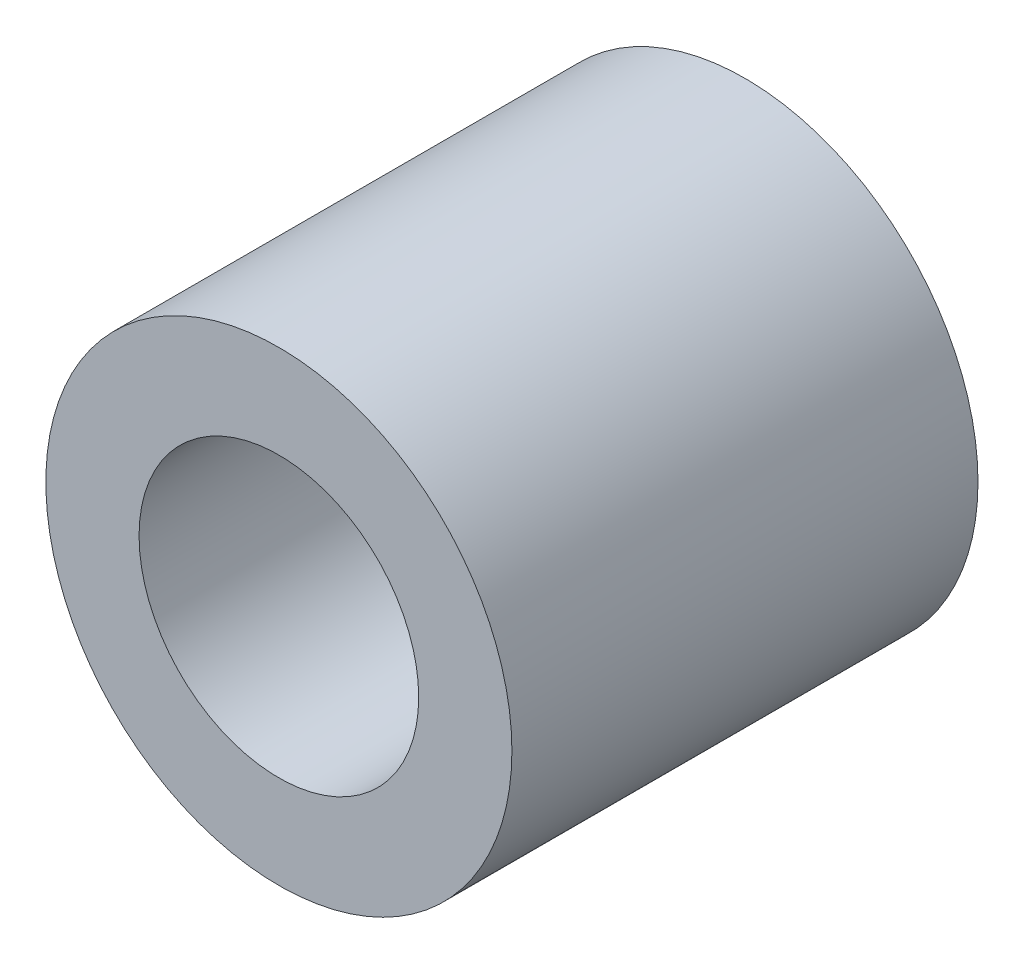
ISO-10303-21;
HEADER;
FILE_DESCRIPTION(('STEP AP214'),'2;1');
FILE_NAME('part.step','',(''),(''),'','','');
FILE_SCHEMA(('AUTOMOTIVE_DESIGN { 1 0 10303 214 1 1 1 1 }'));
ENDSEC;
DATA;
#1=APPLICATION_CONTEXT('core data for automotive mechanical design processes');
#2=APPLICATION_PROTOCOL_DEFINITION('international standard','automotive_design',2000,#1);
#3=PRODUCT_CONTEXT('',#1,'mechanical');
#4=PRODUCT('Part','Part','',(#3));
#5=PRODUCT_RELATED_PRODUCT_CATEGORY('part','',(#4));
#6=PRODUCT_DEFINITION_FORMATION('','',#4);
#7=PRODUCT_DEFINITION_CONTEXT('part definition',#1,'design');
#8=PRODUCT_DEFINITION('design','',#6,#7);
#9=PRODUCT_DEFINITION_SHAPE('','',#8);
#10=(LENGTH_UNIT() NAMED_UNIT(*) SI_UNIT(.MILLI.,.METRE.));
#11=(NAMED_UNIT(*) PLANE_ANGLE_UNIT() SI_UNIT($,.RADIAN.));
#12=(NAMED_UNIT(*) SI_UNIT($,.STERADIAN.) SOLID_ANGLE_UNIT());
#13=UNCERTAINTY_MEASURE_WITH_UNIT(LENGTH_MEASURE(1.E-05),#10,'distance_accuracy_value','');
#14=(GEOMETRIC_REPRESENTATION_CONTEXT(3) GLOBAL_UNCERTAINTY_ASSIGNED_CONTEXT((#13)) GLOBAL_UNIT_ASSIGNED_CONTEXT((#10,
#11,#12)) REPRESENTATION_CONTEXT('',''));
#15=CARTESIAN_POINT('',(0.,0.,0.));
#16=DIRECTION('',(0.,0.,1.));
#17=DIRECTION('',(1.,0.,0.));
#18=AXIS2_PLACEMENT_3D('',#15,#16,#17);
#19=CARTESIAN_POINT('',(0.,0.,10.));
#20=DIRECTION('',(0.,0.,-1.));
#21=DIRECTION('',(-1.,0.,0.));
#22=AXIS2_PLACEMENT_3D('',#19,#20,#21);
#23=CYLINDRICAL_SURFACE('',#22,5.);
#24=CARTESIAN_POINT('',(0.,0.,10.));
#25=DIRECTION('',(0.,0.,1.));
#26=DIRECTION('',(1.,0.,0.));
#27=AXIS2_PLACEMENT_3D('',#24,#25,#26);
#28=CIRCLE('',#27,5.);
#29=CARTESIAN_POINT('',(5.,0.,10.));
#30=VERTEX_POINT('',#29);
#31=EDGE_CURVE('E11',#30,#30,#28,.T.);
#32=ORIENTED_EDGE('',*,*,#31,.F.);
#33=EDGE_LOOP('',(#32));
#34=FACE_BOUND('',#33,.T.);
#35=CARTESIAN_POINT('',(0.,0.,0.));
#36=DIRECTION('',(0.,0.,1.));
#37=DIRECTION('',(1.,0.,0.));
#38=AXIS2_PLACEMENT_3D('',#35,#36,#37);
#39=CIRCLE('',#38,5.);
#40=CARTESIAN_POINT('',(5.,0.,0.));
#41=VERTEX_POINT('',#40);
#42=EDGE_CURVE('E41',#41,#41,#39,.T.);
#43=ORIENTED_EDGE('',*,*,#42,.T.);
#44=EDGE_LOOP('',(#43));
#45=FACE_BOUND('',#44,.T.);
#46=ADVANCED_FACE('F38',(#34,#45),#23,.T.);
#47=CARTESIAN_POINT('',(0.,0.,10.));
#48=DIRECTION('',(0.,0.,1.));
#49=DIRECTION('',(1.,0.,0.));
#50=AXIS2_PLACEMENT_3D('',#47,#48,#49);
#51=PLANE('',#50);
#52=CARTESIAN_POINT('',(-5.81812564589024E-13,1.69399364985701E-13,10.));
#53=DIRECTION('',(0.,0.,1.));
#54=DIRECTION('',(1.,0.,0.));
#55=AXIS2_PLACEMENT_3D('',#52,#53,#54);
#56=CIRCLE('',#55,3.);
#57=CARTESIAN_POINT('',(2.99999999999942,1.69399364985701E-13,10.));
#58=VERTEX_POINT('',#57);
#59=EDGE_CURVE('E85',#58,#58,#56,.T.);
#60=ORIENTED_EDGE('',*,*,#59,.F.);
#61=EDGE_LOOP('',(#60));
#62=FACE_BOUND('',#61,.T.);
#63=ORIENTED_EDGE('',*,*,#31,.T.);
#64=EDGE_LOOP('',(#63));
#65=FACE_BOUND('',#64,.T.);
#66=ADVANCED_FACE('F96',(#62,#65),#51,.T.);
#67=CARTESIAN_POINT('',(0.,0.,0.));
#68=DIRECTION('',(0.,0.,1.));
#69=DIRECTION('',(1.,0.,0.));
#70=AXIS2_PLACEMENT_3D('',#67,#68,#69);
#71=PLANE('',#70);
#72=DIRECTION('',(-0.407437480653137,0.913233102421843,0.));
#73=VECTOR('',#72,1.);
#74=CARTESIAN_POINT('',(-1.90883877794021,0.596937618040385,0.));
#75=LINE('',#74,#73);
#76=CARTESIAN_POINT('',(-0.830860529325319,-1.81925005999979,0.));
#77=VERTEX_POINT('',#76);
#78=CARTESIAN_POINT('',(-1.90883877794021,0.596937618040385,0.));
#79=VERTEX_POINT('',#78);
#80=EDGE_CURVE('E76',#77,#79,#75,.T.);
#81=ORIENTED_EDGE('',*,*,#80,.F.);
#82=CARTESIAN_POINT('',(0.,0.,0.));
#83=DIRECTION('',(0.,0.,-1.));
#84=DIRECTION('',(-1.,0.,0.));
#85=AXIS2_PLACEMENT_3D('',#82,#83,#84);
#86=CIRCLE('',#85,2.);
#87=EDGE_CURVE('E53',#79,#77,#86,.T.);
#88=ORIENTED_EDGE('',*,*,#87,.F.);
#89=EDGE_LOOP('',(#81,#88));
#90=FACE_BOUND('',#89,.T.);
#91=ORIENTED_EDGE('',*,*,#42,.F.);
#92=EDGE_LOOP('',(#91));
#93=FACE_BOUND('',#92,.T.);
#94=ADVANCED_FACE('F93',(#90,#93),#71,.F.);
#95=CARTESIAN_POINT('',(0.,0.,5.));
#96=DIRECTION('',(0.,0.,-1.));
#97=DIRECTION('',(-1.,0.,0.));
#98=AXIS2_PLACEMENT_3D('',#95,#96,#97);
#99=CYLINDRICAL_SURFACE('',#98,2.);
#100=ORIENTED_EDGE('',*,*,#87,.T.);
#101=DIRECTION('',(0.,0.,-1.));
#102=VECTOR('',#101,1.);
#103=CARTESIAN_POINT('',(-0.830860529325319,-1.81925005999979,5.));
#104=LINE('',#103,#102);
#105=CARTESIAN_POINT('',(-0.830860529325319,-1.81925005999979,5.));
#106=VERTEX_POINT('',#105);
#107=EDGE_CURVE('E70',#106,#77,#104,.T.);
#108=ORIENTED_EDGE('',*,*,#107,.F.);
#109=CARTESIAN_POINT('',(0.,0.,5.));
#110=DIRECTION('',(0.,0.,-1.));
#111=DIRECTION('',(-1.,0.,0.));
#112=AXIS2_PLACEMENT_3D('',#109,#110,#111);
#113=CIRCLE('',#112,2.);
#114=CARTESIAN_POINT('',(-1.90883877794021,0.596937618040385,5.));
#115=VERTEX_POINT('',#114);
#116=EDGE_CURVE('E61',#115,#106,#113,.T.);
#117=ORIENTED_EDGE('',*,*,#116,.F.);
#118=DIRECTION('',(0.,0.,-1.));
#119=VECTOR('',#118,1.);
#120=CARTESIAN_POINT('',(-1.90883877794021,0.596937618040385,5.));
#121=LINE('',#120,#119);
#122=EDGE_CURVE('E73',#115,#79,#121,.T.);
#123=ORIENTED_EDGE('',*,*,#122,.T.);
#124=EDGE_LOOP('',(#100,#108,#117,#123));
#125=FACE_BOUND('',#124,.T.);
#126=ADVANCED_FACE('F79',(#125),#99,.F.);
#127=CARTESIAN_POINT('',(-1.90883877794021,0.596937618040385,5.));
#128=DIRECTION('',(-0.913233102421843,-0.407437480653137,0.));
#129=DIRECTION('',(0.407437480653137,-0.913233102421843,0.));
#130=AXIS2_PLACEMENT_3D('',#127,#128,#129);
#131=PLANE('',#130);
#132=ORIENTED_EDGE('',*,*,#80,.T.);
#133=ORIENTED_EDGE('',*,*,#122,.F.);
#134=DIRECTION('',(-0.407437480653137,0.913233102421843,0.));
#135=VECTOR('',#134,1.);
#136=CARTESIAN_POINT('',(-1.90883877794021,0.596937618040385,5.));
#137=LINE('',#136,#135);
#138=EDGE_CURVE('E65',#106,#115,#137,.T.);
#139=ORIENTED_EDGE('',*,*,#138,.F.);
#140=ORIENTED_EDGE('',*,*,#107,.T.);
#141=EDGE_LOOP('',(#132,#133,#139,#140));
#142=FACE_BOUND('',#141,.T.);
#143=ADVANCED_FACE('F74',(#142),#131,.F.);
#144=CARTESIAN_POINT('',(-5.81812564589024E-13,1.69399364985701E-13,5.));
#145=DIRECTION('',(0.,0.,1.));
#146=DIRECTION('',(1.,0.,0.));
#147=AXIS2_PLACEMENT_3D('',#144,#145,#146);
#148=PLANE('',#147);
#149=CARTESIAN_POINT('',(-5.81812564589024E-13,1.69399364985701E-13,5.));
#150=DIRECTION('',(0.,0.,1.));
#151=DIRECTION('',(1.,0.,0.));
#152=AXIS2_PLACEMENT_3D('',#149,#150,#151);
#153=CIRCLE('',#152,3.);
#154=CARTESIAN_POINT('',(2.99999999999942,1.69399364985701E-13,5.));
#155=VERTEX_POINT('',#154);
#156=EDGE_CURVE('E89',#155,#155,#153,.T.);
#157=ORIENTED_EDGE('',*,*,#156,.T.);
#158=EDGE_LOOP('',(#157));
#159=FACE_BOUND('',#158,.T.);
#160=ORIENTED_EDGE('',*,*,#116,.T.);
#161=ORIENTED_EDGE('',*,*,#138,.T.);
#162=EDGE_LOOP('',(#160,#161));
#163=FACE_BOUND('',#162,.T.);
#164=ADVANCED_FACE('F67',(#159,#163),#148,.T.);
#165=CARTESIAN_POINT('',(-5.81812564589024E-13,1.69399364985701E-13,5.));
#166=DIRECTION('',(0.,0.,1.));
#167=DIRECTION('',(1.,0.,0.));
#168=AXIS2_PLACEMENT_3D('',#165,#166,#167);
#169=CYLINDRICAL_SURFACE('',#168,3.);
#170=ORIENTED_EDGE('',*,*,#156,.F.);
#171=EDGE_LOOP('',(#170));
#172=FACE_BOUND('',#171,.T.);
#173=ORIENTED_EDGE('',*,*,#59,.T.);
#174=EDGE_LOOP('',(#173));
#175=FACE_BOUND('',#174,.T.);
#176=ADVANCED_FACE('F119',(#172,#175),#169,.F.);
#177=CLOSED_SHELL('',(#46,#66,#94,#126,#143,#164,#176));
#178=MANIFOLD_SOLID_BREP('B2',#177);
#179=ADVANCED_BREP_SHAPE_REPRESENTATION('',(#18,#178),#14);
#180=SHAPE_DEFINITION_REPRESENTATION(#9,#179);
ENDSEC;
END-ISO-10303-21;
